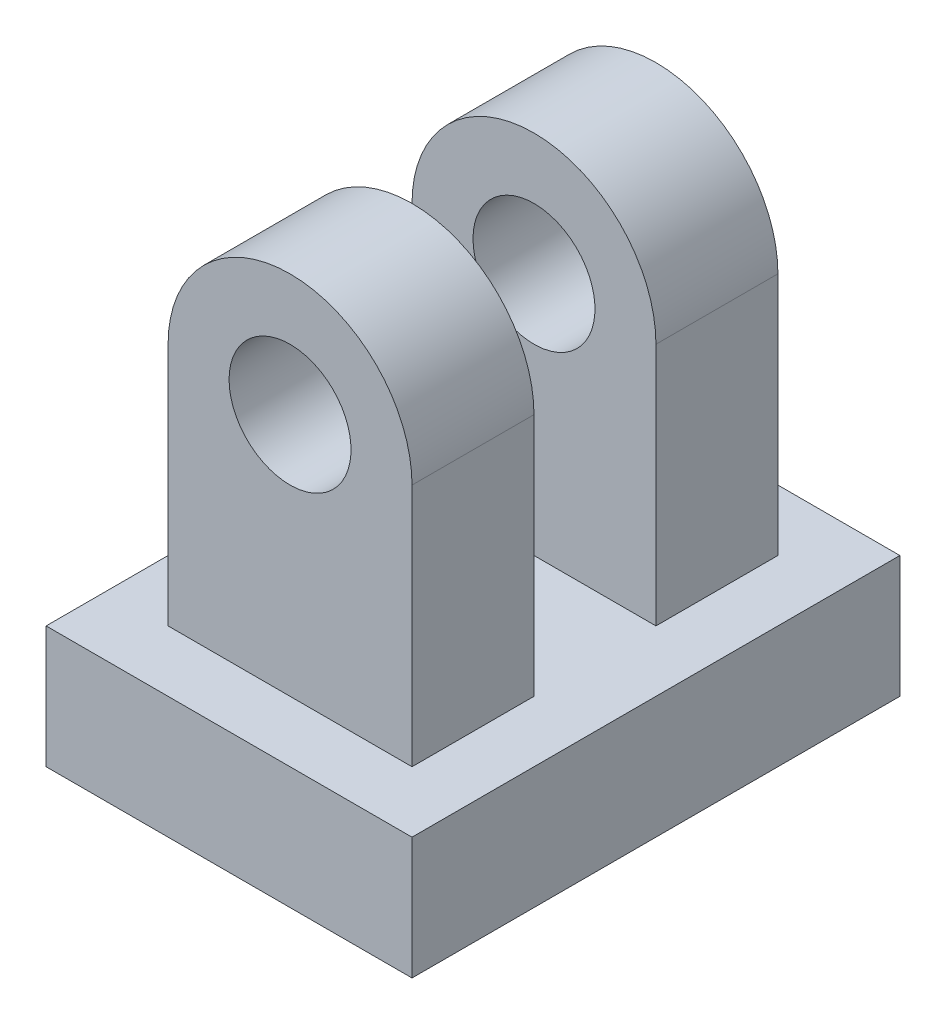
ISO-10303-21;
HEADER;
FILE_DESCRIPTION(('STEP AP214'),'2;1');
FILE_NAME('part.step','',(''),(''),'','','');
FILE_SCHEMA(('AUTOMOTIVE_DESIGN { 1 0 10303 214 1 1 1 1 }'));
ENDSEC;
DATA;
#1=APPLICATION_CONTEXT('core data for automotive mechanical design processes');
#2=APPLICATION_PROTOCOL_DEFINITION('international standard','automotive_design',2000,#1);
#3=PRODUCT_CONTEXT('',#1,'mechanical');
#4=PRODUCT('Part','Part','',(#3));
#5=PRODUCT_RELATED_PRODUCT_CATEGORY('part','',(#4));
#6=PRODUCT_DEFINITION_FORMATION('','',#4);
#7=PRODUCT_DEFINITION_CONTEXT('part definition',#1,'design');
#8=PRODUCT_DEFINITION('design','',#6,#7);
#9=PRODUCT_DEFINITION_SHAPE('','',#8);
#10=(LENGTH_UNIT() NAMED_UNIT(*) SI_UNIT(.MILLI.,.METRE.));
#11=(NAMED_UNIT(*) PLANE_ANGLE_UNIT() SI_UNIT($,.RADIAN.));
#12=(NAMED_UNIT(*) SI_UNIT($,.STERADIAN.) SOLID_ANGLE_UNIT());
#13=UNCERTAINTY_MEASURE_WITH_UNIT(LENGTH_MEASURE(1.E-05),#10,'distance_accuracy_value','');
#14=(GEOMETRIC_REPRESENTATION_CONTEXT(3) GLOBAL_UNCERTAINTY_ASSIGNED_CONTEXT((#13)) GLOBAL_UNIT_ASSIGNED_CONTEXT((#10,
#11,#12)) REPRESENTATION_CONTEXT('',''));
#15=CARTESIAN_POINT('',(0.,0.,0.));
#16=DIRECTION('',(0.,0.,1.));
#17=DIRECTION('',(1.,0.,0.));
#18=AXIS2_PLACEMENT_3D('',#15,#16,#17);
#19=CARTESIAN_POINT('',(0.,3.,0.5));
#20=DIRECTION('',(0.,0.,-1.));
#21=DIRECTION('',(-1.,0.,0.));
#22=AXIS2_PLACEMENT_3D('',#19,#20,#21);
#23=PLANE('',#22);
#24=CARTESIAN_POINT('',(0.,2.,0.5));
#25=DIRECTION('',(0.,0.,-1.));
#26=DIRECTION('',(-1.,0.,0.));
#27=AXIS2_PLACEMENT_3D('',#24,#25,#26);
#28=CIRCLE('',#27,0.5);
#29=CARTESIAN_POINT('',(-0.5,2.,0.5));
#30=VERTEX_POINT('',#29);
#31=EDGE_CURVE('E317',#30,#30,#28,.T.);
#32=ORIENTED_EDGE('',*,*,#31,.F.);
#33=EDGE_LOOP('',(#32));
#34=FACE_BOUND('',#33,.T.);
#35=DIRECTION('',(0.,-1.,0.));
#36=VECTOR('',#35,1.);
#37=CARTESIAN_POINT('',(-1.,3.,0.5));
#38=LINE('',#37,#36);
#39=CARTESIAN_POINT('',(-1.,2.,0.5));
#40=VERTEX_POINT('',#39);
#41=CARTESIAN_POINT('',(-1.,0.,0.5));
#42=VERTEX_POINT('',#41);
#43=EDGE_CURVE('E192',#40,#42,#38,.T.);
#44=ORIENTED_EDGE('',*,*,#43,.F.);
#45=CARTESIAN_POINT('',(0.,2.,0.5));
#46=DIRECTION('',(0.,0.,-1.));
#47=DIRECTION('',(-1.,0.,0.));
#48=AXIS2_PLACEMENT_3D('',#45,#46,#47);
#49=CIRCLE('',#48,1.);
#50=CARTESIAN_POINT('',(1.,2.,0.5));
#51=VERTEX_POINT('',#50);
#52=EDGE_CURVE('E183',#40,#51,#49,.T.);
#53=ORIENTED_EDGE('',*,*,#52,.T.);
#54=DIRECTION('',(0.,-1.,0.));
#55=VECTOR('',#54,1.);
#56=CARTESIAN_POINT('',(1.,3.,0.5));
#57=LINE('',#56,#55);
#58=CARTESIAN_POINT('',(1.,0.,0.5));
#59=VERTEX_POINT('',#58);
#60=EDGE_CURVE('E194',#51,#59,#57,.T.);
#61=ORIENTED_EDGE('',*,*,#60,.T.);
#62=DIRECTION('',(1.,0.,0.));
#63=VECTOR('',#62,1.);
#64=CARTESIAN_POINT('',(0.,0.,0.5));
#65=LINE('',#64,#63);
#66=EDGE_CURVE('E291',#42,#59,#65,.T.);
#67=ORIENTED_EDGE('',*,*,#66,.F.);
#68=EDGE_LOOP('',(#44,#53,#61,#67));
#69=FACE_BOUND('',#68,.T.);
#70=ADVANCED_FACE('F80',(#34,#69),#23,.T.);
#71=CARTESIAN_POINT('',(0.,3.,1.5));
#72=DIRECTION('',(0.,0.,-1.));
#73=DIRECTION('',(-1.,0.,0.));
#74=AXIS2_PLACEMENT_3D('',#71,#72,#73);
#75=PLANE('',#74);
#76=CARTESIAN_POINT('',(0.,2.,1.5));
#77=DIRECTION('',(0.,0.,-1.));
#78=DIRECTION('',(-1.,0.,0.));
#79=AXIS2_PLACEMENT_3D('',#76,#77,#78);
#80=CIRCLE('',#79,0.5);
#81=CARTESIAN_POINT('',(-0.5,2.,1.5));
#82=VERTEX_POINT('',#81);
#83=EDGE_CURVE('E186',#82,#82,#80,.T.);
#84=ORIENTED_EDGE('',*,*,#83,.T.);
#85=EDGE_LOOP('',(#84));
#86=FACE_BOUND('',#85,.T.);
#87=CARTESIAN_POINT('',(0.,2.,1.5));
#88=DIRECTION('',(0.,0.,-1.));
#89=DIRECTION('',(-1.,0.,0.));
#90=AXIS2_PLACEMENT_3D('',#87,#88,#89);
#91=CIRCLE('',#90,1.);
#92=CARTESIAN_POINT('',(-1.,2.,1.5));
#93=VERTEX_POINT('',#92);
#94=CARTESIAN_POINT('',(1.,2.,1.5));
#95=VERTEX_POINT('',#94);
#96=EDGE_CURVE('E170',#93,#95,#91,.T.);
#97=ORIENTED_EDGE('',*,*,#96,.F.);
#98=DIRECTION('',(0.,-1.,0.));
#99=VECTOR('',#98,1.);
#100=CARTESIAN_POINT('',(-1.,3.,1.5));
#101=LINE('',#100,#99);
#102=CARTESIAN_POINT('',(-1.,0.,1.5));
#103=VERTEX_POINT('',#102);
#104=EDGE_CURVE('E104',#93,#103,#101,.T.);
#105=ORIENTED_EDGE('',*,*,#104,.T.);
#106=DIRECTION('',(1.,0.,0.));
#107=VECTOR('',#106,1.);
#108=CARTESIAN_POINT('',(0.,0.,1.5));
#109=LINE('',#108,#107);
#110=CARTESIAN_POINT('',(1.,0.,1.5));
#111=VERTEX_POINT('',#110);
#112=EDGE_CURVE('E196',#103,#111,#109,.T.);
#113=ORIENTED_EDGE('',*,*,#112,.T.);
#114=DIRECTION('',(0.,-1.,0.));
#115=VECTOR('',#114,1.);
#116=CARTESIAN_POINT('',(1.,3.,1.5));
#117=LINE('',#116,#115);
#118=EDGE_CURVE('E173',#95,#111,#117,.T.);
#119=ORIENTED_EDGE('',*,*,#118,.F.);
#120=EDGE_LOOP('',(#97,#105,#113,#119));
#121=FACE_BOUND('',#120,.T.);
#122=ADVANCED_FACE('F172',(#86,#121),#75,.F.);
#123=CARTESIAN_POINT('',(0.,3.,-1.5));
#124=DIRECTION('',(0.,0.,-1.));
#125=DIRECTION('',(-1.,0.,0.));
#126=AXIS2_PLACEMENT_3D('',#123,#124,#125);
#127=PLANE('',#126);
#128=CARTESIAN_POINT('',(0.,2.,-1.5));
#129=DIRECTION('',(0.,0.,-1.));
#130=DIRECTION('',(-1.,0.,0.));
#131=AXIS2_PLACEMENT_3D('',#128,#129,#130);
#132=CIRCLE('',#131,0.5);
#133=CARTESIAN_POINT('',(-0.5,2.,-1.5));
#134=VERTEX_POINT('',#133);
#135=EDGE_CURVE('E321',#134,#134,#132,.T.);
#136=ORIENTED_EDGE('',*,*,#135,.F.);
#137=EDGE_LOOP('',(#136));
#138=FACE_BOUND('',#137,.T.);
#139=DIRECTION('',(0.,-1.,0.));
#140=VECTOR('',#139,1.);
#141=CARTESIAN_POINT('',(-1.,3.,-1.5));
#142=LINE('',#141,#140);
#143=CARTESIAN_POINT('',(-1.,2.,-1.5));
#144=VERTEX_POINT('',#143);
#145=CARTESIAN_POINT('',(-1.,0.,-1.5));
#146=VERTEX_POINT('',#145);
#147=EDGE_CURVE('E296',#144,#146,#142,.T.);
#148=ORIENTED_EDGE('',*,*,#147,.F.);
#149=CARTESIAN_POINT('',(0.,2.,-1.5));
#150=DIRECTION('',(0.,0.,-1.));
#151=DIRECTION('',(-1.,0.,0.));
#152=AXIS2_PLACEMENT_3D('',#149,#150,#151);
#153=CIRCLE('',#152,1.);
#154=CARTESIAN_POINT('',(1.,2.,-1.5));
#155=VERTEX_POINT('',#154);
#156=EDGE_CURVE('E177',#144,#155,#153,.T.);
#157=ORIENTED_EDGE('',*,*,#156,.T.);
#158=DIRECTION('',(0.,-1.,0.));
#159=VECTOR('',#158,1.);
#160=CARTESIAN_POINT('',(1.,3.,-1.5));
#161=LINE('',#160,#159);
#162=CARTESIAN_POINT('',(1.,0.,-1.5));
#163=VERTEX_POINT('',#162);
#164=EDGE_CURVE('E293',#155,#163,#161,.T.);
#165=ORIENTED_EDGE('',*,*,#164,.T.);
#166=DIRECTION('',(1.,0.,0.));
#167=VECTOR('',#166,1.);
#168=CARTESIAN_POINT('',(0.,0.,-1.5));
#169=LINE('',#168,#167);
#170=EDGE_CURVE('E308',#146,#163,#169,.T.);
#171=ORIENTED_EDGE('',*,*,#170,.F.);
#172=EDGE_LOOP('',(#148,#157,#165,#171));
#173=FACE_BOUND('',#172,.T.);
#174=ADVANCED_FACE('F263',(#138,#173),#127,.T.);
#175=CARTESIAN_POINT('',(0.,3.,-0.5));
#176=DIRECTION('',(0.,0.,-1.));
#177=DIRECTION('',(-1.,0.,0.));
#178=AXIS2_PLACEMENT_3D('',#175,#176,#177);
#179=PLANE('',#178);
#180=CARTESIAN_POINT('',(0.,2.,-0.5));
#181=DIRECTION('',(0.,0.,-1.));
#182=DIRECTION('',(-1.,0.,0.));
#183=AXIS2_PLACEMENT_3D('',#180,#181,#182);
#184=CIRCLE('',#183,0.5);
#185=CARTESIAN_POINT('',(-0.5,2.,-0.5));
#186=VERTEX_POINT('',#185);
#187=EDGE_CURVE('E84',#186,#186,#184,.T.);
#188=ORIENTED_EDGE('',*,*,#187,.T.);
#189=EDGE_LOOP('',(#188));
#190=FACE_BOUND('',#189,.T.);
#191=CARTESIAN_POINT('',(0.,2.,-0.5));
#192=DIRECTION('',(0.,0.,-1.));
#193=DIRECTION('',(-1.,0.,0.));
#194=AXIS2_PLACEMENT_3D('',#191,#192,#193);
#195=CIRCLE('',#194,1.);
#196=CARTESIAN_POINT('',(-1.,2.,-0.5));
#197=VERTEX_POINT('',#196);
#198=CARTESIAN_POINT('',(1.,2.,-0.5));
#199=VERTEX_POINT('',#198);
#200=EDGE_CURVE('E312',#197,#199,#195,.T.);
#201=ORIENTED_EDGE('',*,*,#200,.F.);
#202=DIRECTION('',(0.,-1.,0.));
#203=VECTOR('',#202,1.);
#204=CARTESIAN_POINT('',(-1.,3.,-0.5));
#205=LINE('',#204,#203);
#206=CARTESIAN_POINT('',(-1.,0.,-0.5));
#207=VERTEX_POINT('',#206);
#208=EDGE_CURVE('E96',#197,#207,#205,.T.);
#209=ORIENTED_EDGE('',*,*,#208,.T.);
#210=DIRECTION('',(1.,0.,0.));
#211=VECTOR('',#210,1.);
#212=CARTESIAN_POINT('',(0.,0.,-0.5));
#213=LINE('',#212,#211);
#214=CARTESIAN_POINT('',(1.,0.,-0.5));
#215=VERTEX_POINT('',#214);
#216=EDGE_CURVE('E304',#207,#215,#213,.T.);
#217=ORIENTED_EDGE('',*,*,#216,.T.);
#218=DIRECTION('',(0.,-1.,0.));
#219=VECTOR('',#218,1.);
#220=CARTESIAN_POINT('',(1.,3.,-0.5));
#221=LINE('',#220,#219);
#222=EDGE_CURVE('E302',#199,#215,#221,.T.);
#223=ORIENTED_EDGE('',*,*,#222,.F.);
#224=EDGE_LOOP('',(#201,#209,#217,#223));
#225=FACE_BOUND('',#224,.T.);
#226=ADVANCED_FACE('F340',(#190,#225),#179,.F.);
#227=CARTESIAN_POINT('',(1.5,-1.,0.));
#228=DIRECTION('',(-1.,0.,0.));
#229=DIRECTION('',(0.,0.,1.));
#230=AXIS2_PLACEMENT_3D('',#227,#228,#229);
#231=PLANE('',#230);
#232=DIRECTION('',(0.,0.,1.));
#233=VECTOR('',#232,1.);
#234=CARTESIAN_POINT('',(1.5,0.,0.));
#235=LINE('',#234,#233);
#236=CARTESIAN_POINT('',(1.5,0.,-2.));
#237=VERTEX_POINT('',#236);
#238=CARTESIAN_POINT('',(1.5,0.,2.));
#239=VERTEX_POINT('',#238);
#240=EDGE_CURVE('E201',#237,#239,#235,.T.);
#241=ORIENTED_EDGE('',*,*,#240,.T.);
#242=DIRECTION('',(0.,1.,0.));
#243=VECTOR('',#242,1.);
#244=CARTESIAN_POINT('',(1.5,-1.,2.));
#245=LINE('',#244,#243);
#246=CARTESIAN_POINT('',(1.5,-1.,2.));
#247=VERTEX_POINT('',#246);
#248=EDGE_CURVE('E89',#247,#239,#245,.T.);
#249=ORIENTED_EDGE('',*,*,#248,.F.);
#250=DIRECTION('',(0.,0.,1.));
#251=VECTOR('',#250,1.);
#252=CARTESIAN_POINT('',(1.5,-1.,0.));
#253=LINE('',#252,#251);
#254=CARTESIAN_POINT('',(1.5,-1.,-2.));
#255=VERTEX_POINT('',#254);
#256=EDGE_CURVE('E202',#255,#247,#253,.T.);
#257=ORIENTED_EDGE('',*,*,#256,.F.);
#258=DIRECTION('',(0.,1.,0.));
#259=VECTOR('',#258,1.);
#260=CARTESIAN_POINT('',(1.5,-1.,-2.));
#261=LINE('',#260,#259);
#262=EDGE_CURVE('E213',#255,#237,#261,.T.);
#263=ORIENTED_EDGE('',*,*,#262,.T.);
#264=EDGE_LOOP('',(#241,#249,#257,#263));
#265=FACE_BOUND('',#264,.T.);
#266=ADVANCED_FACE('F82',(#265),#231,.F.);
#267=CARTESIAN_POINT('',(0.,-1.,2.));
#268=DIRECTION('',(0.,0.,1.));
#269=DIRECTION('',(1.,0.,0.));
#270=AXIS2_PLACEMENT_3D('',#267,#268,#269);
#271=PLANE('',#270);
#272=DIRECTION('',(1.,0.,0.));
#273=VECTOR('',#272,1.);
#274=CARTESIAN_POINT('',(0.,0.,2.));
#275=LINE('',#274,#273);
#276=CARTESIAN_POINT('',(-1.5,0.,2.));
#277=VERTEX_POINT('',#276);
#278=EDGE_CURVE('E205',#277,#239,#275,.T.);
#279=ORIENTED_EDGE('',*,*,#278,.F.);
#280=DIRECTION('',(0.,1.,0.));
#281=VECTOR('',#280,1.);
#282=CARTESIAN_POINT('',(-1.5,-1.,2.));
#283=LINE('',#282,#281);
#284=CARTESIAN_POINT('',(-1.5,-1.,2.));
#285=VERTEX_POINT('',#284);
#286=EDGE_CURVE('E224',#285,#277,#283,.T.);
#287=ORIENTED_EDGE('',*,*,#286,.F.);
#288=DIRECTION('',(1.,0.,0.));
#289=VECTOR('',#288,1.);
#290=CARTESIAN_POINT('',(0.,-1.,2.));
#291=LINE('',#290,#289);
#292=EDGE_CURVE('E210',#285,#247,#291,.T.);
#293=ORIENTED_EDGE('',*,*,#292,.T.);
#294=ORIENTED_EDGE('',*,*,#248,.T.);
#295=EDGE_LOOP('',(#279,#287,#293,#294));
#296=FACE_BOUND('',#295,.T.);
#297=ADVANCED_FACE('F242',(#296),#271,.T.);
#298=CARTESIAN_POINT('',(-1.5,-1.,0.));
#299=DIRECTION('',(-1.,0.,0.));
#300=DIRECTION('',(0.,0.,1.));
#301=AXIS2_PLACEMENT_3D('',#298,#299,#300);
#302=PLANE('',#301);
#303=DIRECTION('',(0.,0.,1.));
#304=VECTOR('',#303,1.);
#305=CARTESIAN_POINT('',(-1.5,0.,0.));
#306=LINE('',#305,#304);
#307=CARTESIAN_POINT('',(-1.5,0.,-2.));
#308=VERTEX_POINT('',#307);
#309=EDGE_CURVE('E218',#308,#277,#306,.T.);
#310=ORIENTED_EDGE('',*,*,#309,.F.);
#311=DIRECTION('',(0.,1.,0.));
#312=VECTOR('',#311,1.);
#313=CARTESIAN_POINT('',(-1.5,-1.,-2.));
#314=LINE('',#313,#312);
#315=CARTESIAN_POINT('',(-1.5,-1.,-2.));
#316=VERTEX_POINT('',#315);
#317=EDGE_CURVE('E226',#316,#308,#314,.T.);
#318=ORIENTED_EDGE('',*,*,#317,.F.);
#319=DIRECTION('',(0.,0.,1.));
#320=VECTOR('',#319,1.);
#321=CARTESIAN_POINT('',(-1.5,-1.,0.));
#322=LINE('',#321,#320);
#323=EDGE_CURVE('E207',#316,#285,#322,.T.);
#324=ORIENTED_EDGE('',*,*,#323,.T.);
#325=ORIENTED_EDGE('',*,*,#286,.T.);
#326=EDGE_LOOP('',(#310,#318,#324,#325));
#327=FACE_BOUND('',#326,.T.);
#328=ADVANCED_FACE('F249',(#327),#302,.T.);
#329=CARTESIAN_POINT('',(0.,-1.,-2.));
#330=DIRECTION('',(0.,0.,1.));
#331=DIRECTION('',(1.,0.,0.));
#332=AXIS2_PLACEMENT_3D('',#329,#330,#331);
#333=PLANE('',#332);
#334=DIRECTION('',(1.,0.,0.));
#335=VECTOR('',#334,1.);
#336=CARTESIAN_POINT('',(0.,0.,-2.));
#337=LINE('',#336,#335);
#338=EDGE_CURVE('E216',#308,#237,#337,.T.);
#339=ORIENTED_EDGE('',*,*,#338,.T.);
#340=ORIENTED_EDGE('',*,*,#262,.F.);
#341=DIRECTION('',(1.,0.,0.));
#342=VECTOR('',#341,1.);
#343=CARTESIAN_POINT('',(0.,-1.,-2.));
#344=LINE('',#343,#342);
#345=EDGE_CURVE('E204',#316,#255,#344,.T.);
#346=ORIENTED_EDGE('',*,*,#345,.F.);
#347=ORIENTED_EDGE('',*,*,#317,.T.);
#348=EDGE_LOOP('',(#339,#340,#346,#347));
#349=FACE_BOUND('',#348,.T.);
#350=ADVANCED_FACE('F247',(#349),#333,.F.);
#351=CARTESIAN_POINT('',(0.,-1.,0.));
#352=DIRECTION('',(0.,1.,0.));
#353=DIRECTION('',(0.,0.,1.));
#354=AXIS2_PLACEMENT_3D('',#351,#352,#353);
#355=PLANE('',#354);
#356=ORIENTED_EDGE('',*,*,#256,.T.);
#357=ORIENTED_EDGE('',*,*,#292,.F.);
#358=ORIENTED_EDGE('',*,*,#323,.F.);
#359=ORIENTED_EDGE('',*,*,#345,.T.);
#360=EDGE_LOOP('',(#356,#357,#358,#359));
#361=FACE_BOUND('',#360,.T.);
#362=ADVANCED_FACE('F246',(#361),#355,.F.);
#363=CARTESIAN_POINT('',(0.,0.,0.));
#364=DIRECTION('',(0.,1.,0.));
#365=DIRECTION('',(0.,0.,1.));
#366=AXIS2_PLACEMENT_3D('',#363,#364,#365);
#367=PLANE('',#366);
#368=DIRECTION('',(0.,0.,1.));
#369=VECTOR('',#368,1.);
#370=CARTESIAN_POINT('',(1.,0.,0.));
#371=LINE('',#370,#369);
#372=EDGE_CURVE('E285',#163,#215,#371,.T.);
#373=ORIENTED_EDGE('',*,*,#372,.T.);
#374=ORIENTED_EDGE('',*,*,#216,.F.);
#375=DIRECTION('',(0.,0.,1.));
#376=VECTOR('',#375,1.);
#377=CARTESIAN_POINT('',(-1.,0.,0.));
#378=LINE('',#377,#376);
#379=EDGE_CURVE('E306',#146,#207,#378,.T.);
#380=ORIENTED_EDGE('',*,*,#379,.F.);
#381=ORIENTED_EDGE('',*,*,#170,.T.);
#382=EDGE_LOOP('',(#373,#374,#380,#381));
#383=FACE_BOUND('',#382,.T.);
#384=DIRECTION('',(0.,0.,1.));
#385=VECTOR('',#384,1.);
#386=CARTESIAN_POINT('',(0.999999999999999,0.,0.));
#387=LINE('',#386,#385);
#388=EDGE_CURVE('E289',#59,#111,#387,.T.);
#389=ORIENTED_EDGE('',*,*,#388,.T.);
#390=ORIENTED_EDGE('',*,*,#112,.F.);
#391=DIRECTION('',(0.,0.,1.));
#392=VECTOR('',#391,1.);
#393=CARTESIAN_POINT('',(-1.,0.,0.));
#394=LINE('',#393,#392);
#395=EDGE_CURVE('E190',#42,#103,#394,.T.);
#396=ORIENTED_EDGE('',*,*,#395,.F.);
#397=ORIENTED_EDGE('',*,*,#66,.T.);
#398=EDGE_LOOP('',(#389,#390,#396,#397));
#399=FACE_BOUND('',#398,.T.);
#400=ORIENTED_EDGE('',*,*,#240,.F.);
#401=ORIENTED_EDGE('',*,*,#338,.F.);
#402=ORIENTED_EDGE('',*,*,#309,.T.);
#403=ORIENTED_EDGE('',*,*,#278,.T.);
#404=EDGE_LOOP('',(#400,#401,#402,#403));
#405=FACE_BOUND('',#404,.T.);
#406=ADVANCED_FACE('F238',(#383,#399,#405),#367,.T.);
#407=CARTESIAN_POINT('',(0.999999999999999,3.,0.));
#408=DIRECTION('',(1.,0.,0.));
#409=DIRECTION('',(0.,0.,-1.));
#410=AXIS2_PLACEMENT_3D('',#407,#408,#409);
#411=PLANE('',#410);
#412=DIRECTION('',(0.,0.,-1.));
#413=VECTOR('',#412,1.);
#414=CARTESIAN_POINT('',(1.,2.,1.5));
#415=LINE('',#414,#413);
#416=EDGE_CURVE('E314',#95,#51,#415,.T.);
#417=ORIENTED_EDGE('',*,*,#416,.F.);
#418=ORIENTED_EDGE('',*,*,#118,.T.);
#419=ORIENTED_EDGE('',*,*,#388,.F.);
#420=ORIENTED_EDGE('',*,*,#60,.F.);
#421=EDGE_LOOP('',(#417,#418,#419,#420));
#422=FACE_BOUND('',#421,.T.);
#423=ADVANCED_FACE('F270',(#422),#411,.T.);
#424=CARTESIAN_POINT('',(-1.,3.,0.));
#425=DIRECTION('',(1.,0.,0.));
#426=DIRECTION('',(0.,0.,-1.));
#427=AXIS2_PLACEMENT_3D('',#424,#425,#426);
#428=PLANE('',#427);
#429=ORIENTED_EDGE('',*,*,#104,.F.);
#430=DIRECTION('',(0.,0.,-1.));
#431=VECTOR('',#430,1.);
#432=CARTESIAN_POINT('',(-1.,2.,1.5));
#433=LINE('',#432,#431);
#434=EDGE_CURVE('E180',#93,#40,#433,.T.);
#435=ORIENTED_EDGE('',*,*,#434,.T.);
#436=ORIENTED_EDGE('',*,*,#43,.T.);
#437=ORIENTED_EDGE('',*,*,#395,.T.);
#438=EDGE_LOOP('',(#429,#435,#436,#437));
#439=FACE_BOUND('',#438,.T.);
#440=ADVANCED_FACE('F188',(#439),#428,.F.);
#441=CARTESIAN_POINT('',(1.,3.,0.));
#442=DIRECTION('',(1.,0.,0.));
#443=DIRECTION('',(0.,0.,-1.));
#444=AXIS2_PLACEMENT_3D('',#441,#442,#443);
#445=PLANE('',#444);
#446=EDGE_CURVE('E176',#199,#155,#415,.T.);
#447=ORIENTED_EDGE('',*,*,#446,.F.);
#448=ORIENTED_EDGE('',*,*,#222,.T.);
#449=ORIENTED_EDGE('',*,*,#372,.F.);
#450=ORIENTED_EDGE('',*,*,#164,.F.);
#451=EDGE_LOOP('',(#447,#448,#449,#450));
#452=FACE_BOUND('',#451,.T.);
#453=ADVANCED_FACE('F347',(#452),#445,.T.);
#454=CARTESIAN_POINT('',(-1.,3.,0.));
#455=DIRECTION('',(1.,0.,0.));
#456=DIRECTION('',(0.,0.,-1.));
#457=AXIS2_PLACEMENT_3D('',#454,#455,#456);
#458=PLANE('',#457);
#459=ORIENTED_EDGE('',*,*,#208,.F.);
#460=DIRECTION('',(0.,0.,-1.));
#461=VECTOR('',#460,1.);
#462=CARTESIAN_POINT('',(-1.,2.,1.5));
#463=LINE('',#462,#461);
#464=EDGE_CURVE('E12',#197,#144,#463,.T.);
#465=ORIENTED_EDGE('',*,*,#464,.T.);
#466=ORIENTED_EDGE('',*,*,#147,.T.);
#467=ORIENTED_EDGE('',*,*,#379,.T.);
#468=EDGE_LOOP('',(#459,#465,#466,#467));
#469=FACE_BOUND('',#468,.T.);
#470=ADVANCED_FACE('F344',(#469),#458,.F.);
#471=CARTESIAN_POINT('',(0.,2.,1.5));
#472=DIRECTION('',(0.,0.,-1.));
#473=DIRECTION('',(-1.,0.,0.));
#474=AXIS2_PLACEMENT_3D('',#471,#472,#473);
#475=CYLINDRICAL_SURFACE('',#474,1.);
#476=ORIENTED_EDGE('',*,*,#200,.T.);
#477=ORIENTED_EDGE('',*,*,#446,.T.);
#478=ORIENTED_EDGE('',*,*,#156,.F.);
#479=ORIENTED_EDGE('',*,*,#464,.F.);
#480=EDGE_LOOP('',(#476,#477,#478,#479));
#481=FACE_BOUND('',#480,.T.);
#482=ADVANCED_FACE('F339',(#481),#475,.T.);
#483=ORIENTED_EDGE('',*,*,#52,.F.);
#484=ORIENTED_EDGE('',*,*,#434,.F.);
#485=ORIENTED_EDGE('',*,*,#96,.T.);
#486=ORIENTED_EDGE('',*,*,#416,.T.);
#487=EDGE_LOOP('',(#483,#484,#485,#486));
#488=FACE_BOUND('',#487,.T.);
#489=ADVANCED_FACE('F181',(#488),#475,.T.);
#490=CARTESIAN_POINT('',(0.,2.,1.5));
#491=DIRECTION('',(0.,0.,-1.));
#492=DIRECTION('',(-1.,0.,0.));
#493=AXIS2_PLACEMENT_3D('',#490,#491,#492);
#494=CYLINDRICAL_SURFACE('',#493,0.5);
#495=ORIENTED_EDGE('',*,*,#135,.T.);
#496=EDGE_LOOP('',(#495));
#497=FACE_BOUND('',#496,.T.);
#498=ORIENTED_EDGE('',*,*,#187,.F.);
#499=EDGE_LOOP('',(#498));
#500=FACE_BOUND('',#499,.T.);
#501=ADVANCED_FACE('F329',(#497,#500),#494,.F.);
#502=ORIENTED_EDGE('',*,*,#31,.T.);
#503=EDGE_LOOP('',(#502));
#504=FACE_BOUND('',#503,.T.);
#505=ORIENTED_EDGE('',*,*,#83,.F.);
#506=EDGE_LOOP('',(#505));
#507=FACE_BOUND('',#506,.T.);
#508=ADVANCED_FACE('F327',(#504,#507),#494,.F.);
#509=CLOSED_SHELL('',(#70,#122,#174,#226,#266,#297,#328,#350,#362,#406,#423,#440,#453,#470,#482,
#489,#501,#508));
#510=MANIFOLD_SOLID_BREP('B2',#509);
#511=ADVANCED_BREP_SHAPE_REPRESENTATION('',(#18,#510),#14);
#512=SHAPE_DEFINITION_REPRESENTATION(#9,#511);
ENDSEC;
END-ISO-10303-21;
